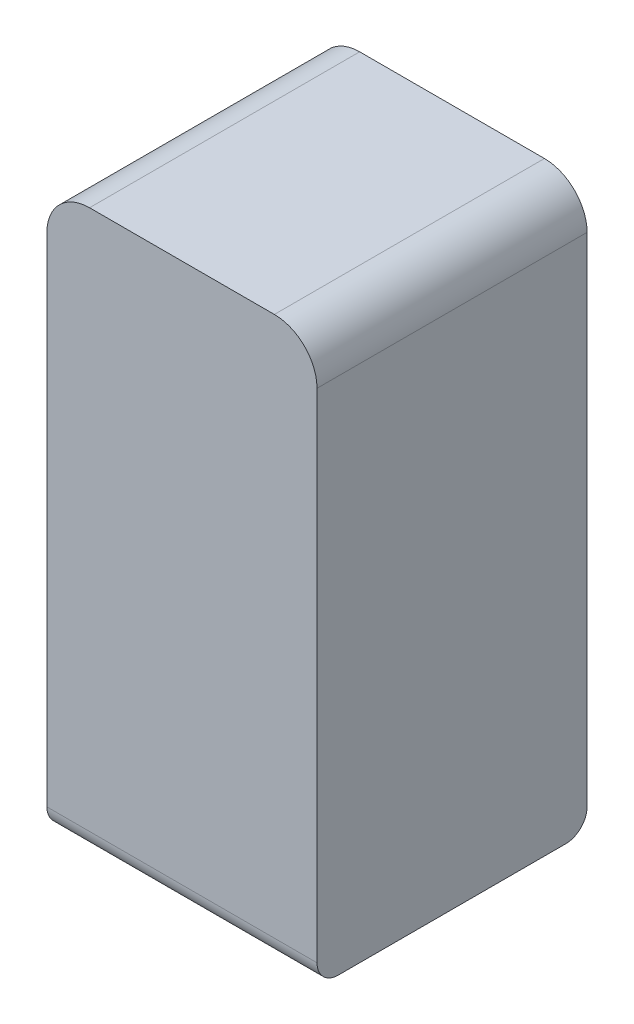
ISO-10303-21;
HEADER;
FILE_DESCRIPTION(('STEP AP214'),'2;1');
FILE_NAME('part.step','',(''),(''),'','','');
FILE_SCHEMA(('AUTOMOTIVE_DESIGN { 1 0 10303 214 1 1 1 1 }'));
ENDSEC;
DATA;
#1=APPLICATION_CONTEXT('core data for automotive mechanical design processes');
#2=APPLICATION_PROTOCOL_DEFINITION('international standard','automotive_design',2000,#1);
#3=PRODUCT_CONTEXT('',#1,'mechanical');
#4=PRODUCT('Part','Part','',(#3));
#5=PRODUCT_RELATED_PRODUCT_CATEGORY('part','',(#4));
#6=PRODUCT_DEFINITION_FORMATION('','',#4);
#7=PRODUCT_DEFINITION_CONTEXT('part definition',#1,'design');
#8=PRODUCT_DEFINITION('design','',#6,#7);
#9=PRODUCT_DEFINITION_SHAPE('','',#8);
#10=(LENGTH_UNIT() NAMED_UNIT(*) SI_UNIT(.MILLI.,.METRE.));
#11=(NAMED_UNIT(*) PLANE_ANGLE_UNIT() SI_UNIT($,.RADIAN.));
#12=(NAMED_UNIT(*) SI_UNIT($,.STERADIAN.) SOLID_ANGLE_UNIT());
#13=UNCERTAINTY_MEASURE_WITH_UNIT(LENGTH_MEASURE(1.E-05),#10,'distance_accuracy_value','');
#14=(GEOMETRIC_REPRESENTATION_CONTEXT(3) GLOBAL_UNCERTAINTY_ASSIGNED_CONTEXT((#13)) GLOBAL_UNIT_ASSIGNED_CONTEXT((#10,
#11,#12)) REPRESENTATION_CONTEXT('',''));
#15=CARTESIAN_POINT('',(0.,0.,0.));
#16=DIRECTION('',(0.,0.,1.));
#17=DIRECTION('',(1.,0.,0.));
#18=AXIS2_PLACEMENT_3D('',#15,#16,#17);
#19=CARTESIAN_POINT('',(19.,-39.5,38.));
#20=DIRECTION('',(-1.,0.,0.));
#21=DIRECTION('',(0.,0.,1.));
#22=AXIS2_PLACEMENT_3D('',#19,#20,#21);
#23=PLANE('',#22);
#24=DIRECTION('',(0.,1.,0.));
#25=VECTOR('',#24,1.);
#26=CARTESIAN_POINT('',(19.,-39.5,38.));
#27=LINE('',#26,#25);
#28=CARTESIAN_POINT('',(19.,-36.5,38.));
#29=VERTEX_POINT('',#28);
#30=CARTESIAN_POINT('',(19.,33.5,38.));
#31=VERTEX_POINT('',#30);
#32=EDGE_CURVE('E138',#29,#31,#27,.T.);
#33=ORIENTED_EDGE('',*,*,#32,.F.);
#34=CARTESIAN_POINT('',(19.,-36.5,35.));
#35=DIRECTION('',(-1.,0.,0.));
#36=DIRECTION('',(0.,0.,1.));
#37=AXIS2_PLACEMENT_3D('',#34,#35,#36);
#38=CIRCLE('',#37,3.);
#39=CARTESIAN_POINT('',(19.,-39.5,35.));
#40=VERTEX_POINT('',#39);
#41=EDGE_CURVE('E162',#29,#40,#38,.F.);
#42=ORIENTED_EDGE('',*,*,#41,.T.);
#43=DIRECTION('',(0.,0.,-1.));
#44=VECTOR('',#43,1.);
#45=CARTESIAN_POINT('',(19.,-39.5,38.));
#46=LINE('',#45,#44);
#47=CARTESIAN_POINT('',(19.,-39.5,3.));
#48=VERTEX_POINT('',#47);
#49=EDGE_CURVE('E142',#40,#48,#46,.T.);
#50=ORIENTED_EDGE('',*,*,#49,.T.);
#51=CARTESIAN_POINT('',(19.,-36.5,3.));
#52=DIRECTION('',(-1.,0.,0.));
#53=DIRECTION('',(0.,0.,1.));
#54=AXIS2_PLACEMENT_3D('',#51,#52,#53);
#55=CIRCLE('',#54,3.);
#56=CARTESIAN_POINT('',(19.,-36.5,0.));
#57=VERTEX_POINT('',#56);
#58=EDGE_CURVE('E159',#48,#57,#55,.F.);
#59=ORIENTED_EDGE('',*,*,#58,.T.);
#60=DIRECTION('',(0.,1.,0.));
#61=VECTOR('',#60,1.);
#62=CARTESIAN_POINT('',(19.,-39.5,0.));
#63=LINE('',#62,#61);
#64=CARTESIAN_POINT('',(19.,33.5,0.));
#65=VERTEX_POINT('',#64);
#66=EDGE_CURVE('E132',#57,#65,#63,.T.);
#67=ORIENTED_EDGE('',*,*,#66,.T.);
#68=DIRECTION('',(0.,0.,-1.));
#69=VECTOR('',#68,1.);
#70=CARTESIAN_POINT('',(19.,33.5,38.));
#71=LINE('',#70,#69);
#72=EDGE_CURVE('E117',#65,#31,#71,.F.);
#73=ORIENTED_EDGE('',*,*,#72,.T.);
#74=EDGE_LOOP('',(#33,#42,#50,#59,#67,#73));
#75=FACE_BOUND('',#74,.T.);
#76=ADVANCED_FACE('F44',(#75),#23,.F.);
#77=CARTESIAN_POINT('',(-19.,39.5,38.));
#78=DIRECTION('',(0.,-1.,0.));
#79=DIRECTION('',(0.,0.,-1.));
#80=AXIS2_PLACEMENT_3D('',#77,#78,#79);
#81=PLANE('',#80);
#82=DIRECTION('',(-1.,0.,0.));
#83=VECTOR('',#82,1.);
#84=CARTESIAN_POINT('',(-19.,39.5,38.));
#85=LINE('',#84,#83);
#86=CARTESIAN_POINT('',(13.,39.5,38.));
#87=VERTEX_POINT('',#86);
#88=CARTESIAN_POINT('',(-13.,39.5,38.));
#89=VERTEX_POINT('',#88);
#90=EDGE_CURVE('E126',#87,#89,#85,.T.);
#91=ORIENTED_EDGE('',*,*,#90,.F.);
#92=DIRECTION('',(0.,0.,-1.));
#93=VECTOR('',#92,1.);
#94=CARTESIAN_POINT('',(13.,39.5,38.));
#95=LINE('',#94,#93);
#96=CARTESIAN_POINT('',(13.,39.5,0.));
#97=VERTEX_POINT('',#96);
#98=EDGE_CURVE('E116',#87,#97,#95,.T.);
#99=ORIENTED_EDGE('',*,*,#98,.T.);
#100=DIRECTION('',(-1.,0.,0.));
#101=VECTOR('',#100,1.);
#102=CARTESIAN_POINT('',(-19.,39.5,0.));
#103=LINE('',#102,#101);
#104=CARTESIAN_POINT('',(-13.,39.5,0.));
#105=VERTEX_POINT('',#104);
#106=EDGE_CURVE('E127',#97,#105,#103,.T.);
#107=ORIENTED_EDGE('',*,*,#106,.T.);
#108=DIRECTION('',(0.,0.,-1.));
#109=VECTOR('',#108,1.);
#110=CARTESIAN_POINT('',(-13.,39.5,38.));
#111=LINE('',#110,#109);
#112=EDGE_CURVE('E128',#105,#89,#111,.F.);
#113=ORIENTED_EDGE('',*,*,#112,.T.);
#114=EDGE_LOOP('',(#91,#99,#107,#113));
#115=FACE_BOUND('',#114,.T.);
#116=ADVANCED_FACE('F123',(#115),#81,.F.);
#117=CARTESIAN_POINT('',(-19.,-39.5,38.));
#118=DIRECTION('',(1.,0.,0.));
#119=DIRECTION('',(0.,0.,-1.));
#120=AXIS2_PLACEMENT_3D('',#117,#118,#119);
#121=PLANE('',#120);
#122=DIRECTION('',(0.,0.,-1.));
#123=VECTOR('',#122,1.);
#124=CARTESIAN_POINT('',(-19.,-39.5,38.));
#125=LINE('',#124,#123);
#126=CARTESIAN_POINT('',(-19.,-39.5,35.));
#127=VERTEX_POINT('',#126);
#128=CARTESIAN_POINT('',(-19.,-39.5,3.));
#129=VERTEX_POINT('',#128);
#130=EDGE_CURVE('E144',#127,#129,#125,.T.);
#131=ORIENTED_EDGE('',*,*,#130,.F.);
#132=CARTESIAN_POINT('',(-19.,-36.5,35.));
#133=DIRECTION('',(1.,0.,0.));
#134=DIRECTION('',(0.,0.,-1.));
#135=AXIS2_PLACEMENT_3D('',#132,#133,#134);
#136=CIRCLE('',#135,3.);
#137=CARTESIAN_POINT('',(-19.,-36.5,38.));
#138=VERTEX_POINT('',#137);
#139=EDGE_CURVE('E52',#127,#138,#136,.F.);
#140=ORIENTED_EDGE('',*,*,#139,.T.);
#141=DIRECTION('',(0.,-1.,0.));
#142=VECTOR('',#141,1.);
#143=CARTESIAN_POINT('',(-19.,-39.5,38.));
#144=LINE('',#143,#142);
#145=CARTESIAN_POINT('',(-19.,33.5,38.));
#146=VERTEX_POINT('',#145);
#147=EDGE_CURVE('E143',#146,#138,#144,.T.);
#148=ORIENTED_EDGE('',*,*,#147,.F.);
#149=DIRECTION('',(0.,0.,-1.));
#150=VECTOR('',#149,1.);
#151=CARTESIAN_POINT('',(-19.,33.5,38.));
#152=LINE('',#151,#150);
#153=CARTESIAN_POINT('',(-19.,33.5,0.));
#154=VERTEX_POINT('',#153);
#155=EDGE_CURVE('E152',#146,#154,#152,.T.);
#156=ORIENTED_EDGE('',*,*,#155,.T.);
#157=DIRECTION('',(0.,-1.,0.));
#158=VECTOR('',#157,1.);
#159=CARTESIAN_POINT('',(-19.,-39.5,0.));
#160=LINE('',#159,#158);
#161=CARTESIAN_POINT('',(-19.,-36.5,0.));
#162=VERTEX_POINT('',#161);
#163=EDGE_CURVE('E133',#154,#162,#160,.T.);
#164=ORIENTED_EDGE('',*,*,#163,.T.);
#165=CARTESIAN_POINT('',(-19.,-36.5,3.));
#166=DIRECTION('',(1.,0.,0.));
#167=DIRECTION('',(0.,0.,-1.));
#168=AXIS2_PLACEMENT_3D('',#165,#166,#167);
#169=CIRCLE('',#168,3.);
#170=EDGE_CURVE('E63',#162,#129,#169,.F.);
#171=ORIENTED_EDGE('',*,*,#170,.T.);
#172=EDGE_LOOP('',(#131,#140,#148,#156,#164,#171));
#173=FACE_BOUND('',#172,.T.);
#174=ADVANCED_FACE('F175',(#173),#121,.F.);
#175=CARTESIAN_POINT('',(-19.,-39.5,38.));
#176=DIRECTION('',(0.,1.,0.));
#177=DIRECTION('',(0.,0.,1.));
#178=AXIS2_PLACEMENT_3D('',#175,#176,#177);
#179=PLANE('',#178);
#180=ORIENTED_EDGE('',*,*,#49,.F.);
#181=DIRECTION('',(1.,0.,0.));
#182=VECTOR('',#181,1.);
#183=CARTESIAN_POINT('',(-19.,-39.5,35.));
#184=LINE('',#183,#182);
#185=EDGE_CURVE('E170',#40,#127,#184,.F.);
#186=ORIENTED_EDGE('',*,*,#185,.T.);
#187=ORIENTED_EDGE('',*,*,#130,.T.);
#188=DIRECTION('',(1.,0.,0.));
#189=VECTOR('',#188,1.);
#190=CARTESIAN_POINT('',(19.,-39.5,3.));
#191=LINE('',#190,#189);
#192=EDGE_CURVE('E165',#129,#48,#191,.T.);
#193=ORIENTED_EDGE('',*,*,#192,.T.);
#194=EDGE_LOOP('',(#180,#186,#187,#193));
#195=FACE_BOUND('',#194,.T.);
#196=ADVANCED_FACE('F184',(#195),#179,.F.);
#197=CARTESIAN_POINT('',(0.,0.,38.));
#198=DIRECTION('',(0.,0.,-1.));
#199=DIRECTION('',(-1.,0.,0.));
#200=AXIS2_PLACEMENT_3D('',#197,#198,#199);
#201=PLANE('',#200);
#202=ORIENTED_EDGE('',*,*,#147,.T.);
#203=DIRECTION('',(1.,0.,0.));
#204=VECTOR('',#203,1.);
#205=CARTESIAN_POINT('',(0.,-36.5,38.));
#206=LINE('',#205,#204);
#207=EDGE_CURVE('E160',#138,#29,#206,.T.);
#208=ORIENTED_EDGE('',*,*,#207,.T.);
#209=ORIENTED_EDGE('',*,*,#32,.T.);
#210=CARTESIAN_POINT('',(13.,33.5,38.));
#211=DIRECTION('',(0.,0.,-1.));
#212=DIRECTION('',(-1.,0.,0.));
#213=AXIS2_PLACEMENT_3D('',#210,#211,#212);
#214=CIRCLE('',#213,6.);
#215=EDGE_CURVE('E155',#31,#87,#214,.F.);
#216=ORIENTED_EDGE('',*,*,#215,.T.);
#217=ORIENTED_EDGE('',*,*,#90,.T.);
#218=CARTESIAN_POINT('',(-13.,33.5,38.));
#219=DIRECTION('',(0.,0.,-1.));
#220=DIRECTION('',(-1.,0.,0.));
#221=AXIS2_PLACEMENT_3D('',#218,#219,#220);
#222=CIRCLE('',#221,6.);
#223=EDGE_CURVE('E148',#89,#146,#222,.F.);
#224=ORIENTED_EDGE('',*,*,#223,.T.);
#225=EDGE_LOOP('',(#202,#208,#209,#216,#217,#224));
#226=FACE_BOUND('',#225,.T.);
#227=ADVANCED_FACE('F178',(#226),#201,.F.);
#228=CARTESIAN_POINT('',(0.,0.,0.));
#229=DIRECTION('',(0.,0.,-1.));
#230=DIRECTION('',(-1.,0.,0.));
#231=AXIS2_PLACEMENT_3D('',#228,#229,#230);
#232=PLANE('',#231);
#233=ORIENTED_EDGE('',*,*,#66,.F.);
#234=DIRECTION('',(1.,0.,0.));
#235=VECTOR('',#234,1.);
#236=CARTESIAN_POINT('',(-19.,-36.5,0.));
#237=LINE('',#236,#235);
#238=EDGE_CURVE('E11',#57,#162,#237,.F.);
#239=ORIENTED_EDGE('',*,*,#238,.T.);
#240=ORIENTED_EDGE('',*,*,#163,.F.);
#241=CARTESIAN_POINT('',(-13.,33.5,0.));
#242=DIRECTION('',(0.,0.,-1.));
#243=DIRECTION('',(-1.,0.,0.));
#244=AXIS2_PLACEMENT_3D('',#241,#242,#243);
#245=CIRCLE('',#244,6.);
#246=EDGE_CURVE('E119',#154,#105,#245,.T.);
#247=ORIENTED_EDGE('',*,*,#246,.T.);
#248=ORIENTED_EDGE('',*,*,#106,.F.);
#249=CARTESIAN_POINT('',(13.,33.5,0.));
#250=DIRECTION('',(0.,0.,-1.));
#251=DIRECTION('',(-1.,0.,0.));
#252=AXIS2_PLACEMENT_3D('',#249,#250,#251);
#253=CIRCLE('',#252,6.);
#254=EDGE_CURVE('E115',#97,#65,#253,.T.);
#255=ORIENTED_EDGE('',*,*,#254,.T.);
#256=EDGE_LOOP('',(#233,#239,#240,#247,#248,#255));
#257=FACE_BOUND('',#256,.T.);
#258=ADVANCED_FACE('F135',(#257),#232,.T.);
#259=CARTESIAN_POINT('',(13.,33.5,38.));
#260=DIRECTION('',(0.,0.,-1.));
#261=DIRECTION('',(-1.,0.,0.));
#262=AXIS2_PLACEMENT_3D('',#259,#260,#261);
#263=CYLINDRICAL_SURFACE('',#262,6.);
#264=ORIENTED_EDGE('',*,*,#215,.F.);
#265=ORIENTED_EDGE('',*,*,#72,.F.);
#266=ORIENTED_EDGE('',*,*,#254,.F.);
#267=ORIENTED_EDGE('',*,*,#98,.F.);
#268=EDGE_LOOP('',(#264,#265,#266,#267));
#269=FACE_BOUND('',#268,.T.);
#270=ADVANCED_FACE('F114',(#269),#263,.T.);
#271=CARTESIAN_POINT('',(-13.,33.5,38.));
#272=DIRECTION('',(0.,0.,-1.));
#273=DIRECTION('',(-1.,0.,0.));
#274=AXIS2_PLACEMENT_3D('',#271,#272,#273);
#275=CYLINDRICAL_SURFACE('',#274,6.);
#276=ORIENTED_EDGE('',*,*,#223,.F.);
#277=ORIENTED_EDGE('',*,*,#112,.F.);
#278=ORIENTED_EDGE('',*,*,#246,.F.);
#279=ORIENTED_EDGE('',*,*,#155,.F.);
#280=EDGE_LOOP('',(#276,#277,#278,#279));
#281=FACE_BOUND('',#280,.T.);
#282=ADVANCED_FACE('F192',(#281),#275,.T.);
#283=CARTESIAN_POINT('',(0.,-36.5,35.));
#284=DIRECTION('',(1.,0.,0.));
#285=DIRECTION('',(0.,0.,-1.));
#286=AXIS2_PLACEMENT_3D('',#283,#284,#285);
#287=CYLINDRICAL_SURFACE('',#286,3.);
#288=ORIENTED_EDGE('',*,*,#139,.F.);
#289=ORIENTED_EDGE('',*,*,#185,.F.);
#290=ORIENTED_EDGE('',*,*,#41,.F.);
#291=ORIENTED_EDGE('',*,*,#207,.F.);
#292=EDGE_LOOP('',(#288,#289,#290,#291));
#293=FACE_BOUND('',#292,.T.);
#294=ADVANCED_FACE('F181',(#293),#287,.T.);
#295=CARTESIAN_POINT('',(-19.,-36.5,3.));
#296=DIRECTION('',(-1.,0.,0.));
#297=DIRECTION('',(0.,0.,1.));
#298=AXIS2_PLACEMENT_3D('',#295,#296,#297);
#299=CYLINDRICAL_SURFACE('',#298,3.);
#300=ORIENTED_EDGE('',*,*,#170,.F.);
#301=ORIENTED_EDGE('',*,*,#238,.F.);
#302=ORIENTED_EDGE('',*,*,#58,.F.);
#303=ORIENTED_EDGE('',*,*,#192,.F.);
#304=EDGE_LOOP('',(#300,#301,#302,#303));
#305=FACE_BOUND('',#304,.T.);
#306=ADVANCED_FACE('F50',(#305),#299,.T.);
#307=CLOSED_SHELL('',(#76,#116,#174,#196,#227,#258,#270,#282,#294,#306));
#308=MANIFOLD_SOLID_BREP('B2',#307);
#309=ADVANCED_BREP_SHAPE_REPRESENTATION('',(#18,#308),#14);
#310=SHAPE_DEFINITION_REPRESENTATION(#9,#309);
ENDSEC;
END-ISO-10303-21;
